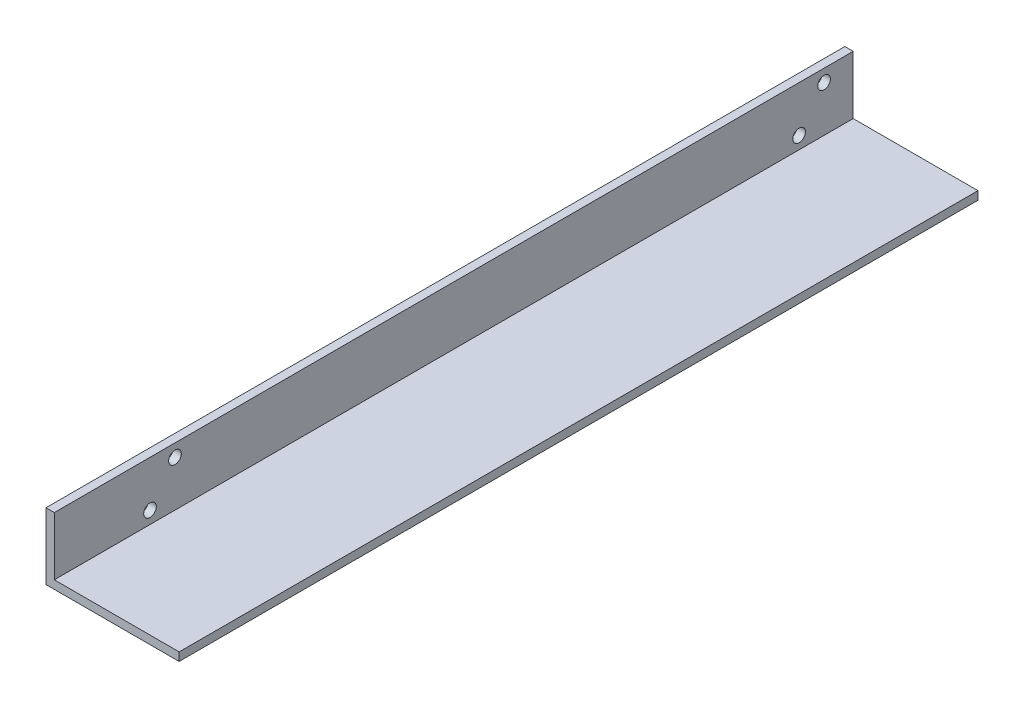
ISO-10303-21;
HEADER;
FILE_DESCRIPTION(('STEP AP214'),'2;1');
FILE_NAME('part.step','',(''),(''),'','','');
FILE_SCHEMA(('AUTOMOTIVE_DESIGN { 1 0 10303 214 1 1 1 1 }'));
ENDSEC;
DATA;
#1=APPLICATION_CONTEXT('core data for automotive mechanical design processes');
#2=APPLICATION_PROTOCOL_DEFINITION('international standard','automotive_design',2000,#1);
#3=PRODUCT_CONTEXT('',#1,'mechanical');
#4=PRODUCT('Part','Part','',(#3));
#5=PRODUCT_RELATED_PRODUCT_CATEGORY('part','',(#4));
#6=PRODUCT_DEFINITION_FORMATION('','',#4);
#7=PRODUCT_DEFINITION_CONTEXT('part definition',#1,'design');
#8=PRODUCT_DEFINITION('design','',#6,#7);
#9=PRODUCT_DEFINITION_SHAPE('','',#8);
#10=(LENGTH_UNIT() NAMED_UNIT(*) SI_UNIT(.MILLI.,.METRE.));
#11=(NAMED_UNIT(*) PLANE_ANGLE_UNIT() SI_UNIT($,.RADIAN.));
#12=(NAMED_UNIT(*) SI_UNIT($,.STERADIAN.) SOLID_ANGLE_UNIT());
#13=UNCERTAINTY_MEASURE_WITH_UNIT(LENGTH_MEASURE(1.E-05),#10,'distance_accuracy_value','');
#14=(GEOMETRIC_REPRESENTATION_CONTEXT(3) GLOBAL_UNCERTAINTY_ASSIGNED_CONTEXT((#13)) GLOBAL_UNIT_ASSIGNED_CONTEXT((#10,
#11,#12)) REPRESENTATION_CONTEXT('',''));
#15=CARTESIAN_POINT('',(0.,0.,0.));
#16=DIRECTION('',(0.,0.,1.));
#17=DIRECTION('',(1.,0.,0.));
#18=AXIS2_PLACEMENT_3D('',#15,#16,#17);
#19=CARTESIAN_POINT('',(0.,0.,304.8));
#20=DIRECTION('',(1.,0.,0.));
#21=DIRECTION('',(0.,0.,-1.));
#22=AXIS2_PLACEMENT_3D('',#19,#20,#21);
#23=PLANE('',#22);
#24=CARTESIAN_POINT('',(0.,7.93749999999971,268.2875));
#25=DIRECTION('',(-1.,0.,0.));
#26=DIRECTION('',(0.,0.,1.));
#27=AXIS2_PLACEMENT_3D('',#24,#25,#26);
#28=CIRCLE('',#27,2.41299999999999);
#29=CARTESIAN_POINT('',(0.,7.93749999999971,270.7005));
#30=VERTEX_POINT('',#29);
#31=EDGE_CURVE('E208',#30,#30,#28,.T.);
#32=ORIENTED_EDGE('',*,*,#31,.F.);
#33=EDGE_LOOP('',(#32));
#34=FACE_BOUND('',#33,.T.);
#35=CARTESIAN_POINT('',(0.,20.6374999999996,11.1125));
#36=DIRECTION('',(-1.,0.,0.));
#37=DIRECTION('',(0.,0.,1.));
#38=AXIS2_PLACEMENT_3D('',#35,#36,#37);
#39=CIRCLE('',#38,2.413);
#40=CARTESIAN_POINT('',(0.,20.6374999999996,13.5255));
#41=VERTEX_POINT('',#40);
#42=EDGE_CURVE('E212',#41,#41,#39,.T.);
#43=ORIENTED_EDGE('',*,*,#42,.F.);
#44=EDGE_LOOP('',(#43));
#45=FACE_BOUND('',#44,.T.);
#46=CARTESIAN_POINT('',(0.,7.93749999999971,20.6375000000001));
#47=DIRECTION('',(-1.,0.,0.));
#48=DIRECTION('',(0.,0.,1.));
#49=AXIS2_PLACEMENT_3D('',#46,#47,#48);
#50=CIRCLE('',#49,2.413);
#51=CARTESIAN_POINT('',(0.,7.93749999999971,23.0505000000001));
#52=VERTEX_POINT('',#51);
#53=EDGE_CURVE('E216',#52,#52,#50,.T.);
#54=ORIENTED_EDGE('',*,*,#53,.F.);
#55=EDGE_LOOP('',(#54));
#56=FACE_BOUND('',#55,.T.);
#57=CARTESIAN_POINT('',(0.,20.6374999999996,258.7625));
#58=DIRECTION('',(-1.,0.,0.));
#59=DIRECTION('',(0.,0.,1.));
#60=AXIS2_PLACEMENT_3D('',#57,#58,#59);
#61=CIRCLE('',#60,2.413);
#62=CARTESIAN_POINT('',(0.,20.6374999999996,261.1755));
#63=VERTEX_POINT('',#62);
#64=EDGE_CURVE('E219',#63,#63,#61,.T.);
#65=ORIENTED_EDGE('',*,*,#64,.F.);
#66=EDGE_LOOP('',(#65));
#67=FACE_BOUND('',#66,.T.);
#68=DIRECTION('',(0.,-1.,0.));
#69=VECTOR('',#68,1.);
#70=CARTESIAN_POINT('',(0.,0.,0.));
#71=LINE('',#70,#69);
#72=CARTESIAN_POINT('',(0.,25.4,0.));
#73=VERTEX_POINT('',#72);
#74=CARTESIAN_POINT('',(0.,0.,0.));
#75=VERTEX_POINT('',#74);
#76=EDGE_CURVE('E152',#73,#75,#71,.T.);
#77=ORIENTED_EDGE('',*,*,#76,.T.);
#78=DIRECTION('',(0.,0.,-1.));
#79=VECTOR('',#78,1.);
#80=CARTESIAN_POINT('',(0.,0.,304.8));
#81=LINE('',#80,#79);
#82=CARTESIAN_POINT('',(0.,0.,304.8));
#83=VERTEX_POINT('',#82);
#84=EDGE_CURVE('E13',#83,#75,#81,.T.);
#85=ORIENTED_EDGE('',*,*,#84,.F.);
#86=DIRECTION('',(0.,-1.,0.));
#87=VECTOR('',#86,1.);
#88=CARTESIAN_POINT('',(0.,0.,304.8));
#89=LINE('',#88,#87);
#90=CARTESIAN_POINT('',(0.,25.4,304.8));
#91=VERTEX_POINT('',#90);
#92=EDGE_CURVE('E169',#91,#83,#89,.T.);
#93=ORIENTED_EDGE('',*,*,#92,.F.);
#94=DIRECTION('',(0.,0.,-1.));
#95=VECTOR('',#94,1.);
#96=CARTESIAN_POINT('',(0.,25.4,304.8));
#97=LINE('',#96,#95);
#98=EDGE_CURVE('E148',#91,#73,#97,.T.);
#99=ORIENTED_EDGE('',*,*,#98,.T.);
#100=EDGE_LOOP('',(#77,#85,#93,#99));
#101=FACE_BOUND('',#100,.T.);
#102=ADVANCED_FACE('F50',(#34,#45,#56,#67,#101),#23,.F.);
#103=CARTESIAN_POINT('',(0.,0.,304.8));
#104=DIRECTION('',(0.,1.,0.));
#105=DIRECTION('',(0.,0.,1.));
#106=AXIS2_PLACEMENT_3D('',#103,#104,#105);
#107=PLANE('',#106);
#108=DIRECTION('',(1.,0.,0.));
#109=VECTOR('',#108,1.);
#110=CARTESIAN_POINT('',(0.,0.,0.));
#111=LINE('',#110,#109);
#112=CARTESIAN_POINT('',(50.8,0.,0.));
#113=VERTEX_POINT('',#112);
#114=EDGE_CURVE('E156',#75,#113,#111,.T.);
#115=ORIENTED_EDGE('',*,*,#114,.T.);
#116=DIRECTION('',(0.,0.,-1.));
#117=VECTOR('',#116,1.);
#118=CARTESIAN_POINT('',(50.8,0.,304.8));
#119=LINE('',#118,#117);
#120=CARTESIAN_POINT('',(50.8,0.,304.8));
#121=VERTEX_POINT('',#120);
#122=EDGE_CURVE('E59',#121,#113,#119,.T.);
#123=ORIENTED_EDGE('',*,*,#122,.F.);
#124=DIRECTION('',(1.,0.,0.));
#125=VECTOR('',#124,1.);
#126=CARTESIAN_POINT('',(0.,0.,304.8));
#127=LINE('',#126,#125);
#128=EDGE_CURVE('E116',#83,#121,#127,.T.);
#129=ORIENTED_EDGE('',*,*,#128,.F.);
#130=ORIENTED_EDGE('',*,*,#84,.T.);
#131=EDGE_LOOP('',(#115,#123,#129,#130));
#132=FACE_BOUND('',#131,.T.);
#133=ADVANCED_FACE('F200',(#132),#107,.F.);
#134=CARTESIAN_POINT('',(50.8,0.,304.8));
#135=DIRECTION('',(-1.,0.,0.));
#136=DIRECTION('',(0.,0.,1.));
#137=AXIS2_PLACEMENT_3D('',#134,#135,#136);
#138=PLANE('',#137);
#139=DIRECTION('',(0.,1.,0.));
#140=VECTOR('',#139,1.);
#141=CARTESIAN_POINT('',(50.8,0.,0.));
#142=LINE('',#141,#140);
#143=CARTESIAN_POINT('',(50.8,3.175,0.));
#144=VERTEX_POINT('',#143);
#145=EDGE_CURVE('E160',#113,#144,#142,.T.);
#146=ORIENTED_EDGE('',*,*,#145,.T.);
#147=DIRECTION('',(0.,0.,-1.));
#148=VECTOR('',#147,1.);
#149=CARTESIAN_POINT('',(50.8,3.175,304.8));
#150=LINE('',#149,#148);
#151=CARTESIAN_POINT('',(50.8,3.175,304.8));
#152=VERTEX_POINT('',#151);
#153=EDGE_CURVE('E140',#152,#144,#150,.T.);
#154=ORIENTED_EDGE('',*,*,#153,.F.);
#155=DIRECTION('',(0.,1.,0.));
#156=VECTOR('',#155,1.);
#157=CARTESIAN_POINT('',(50.8,0.,304.8));
#158=LINE('',#157,#156);
#159=EDGE_CURVE('E129',#121,#152,#158,.T.);
#160=ORIENTED_EDGE('',*,*,#159,.F.);
#161=ORIENTED_EDGE('',*,*,#122,.T.);
#162=EDGE_LOOP('',(#146,#154,#160,#161));
#163=FACE_BOUND('',#162,.T.);
#164=ADVANCED_FACE('F181',(#163),#138,.F.);
#165=CARTESIAN_POINT('',(3.175,3.175,304.8));
#166=DIRECTION('',(0.,-1.,0.));
#167=DIRECTION('',(0.,0.,-1.));
#168=AXIS2_PLACEMENT_3D('',#165,#166,#167);
#169=PLANE('',#168);
#170=DIRECTION('',(-1.,0.,0.));
#171=VECTOR('',#170,1.);
#172=CARTESIAN_POINT('',(3.175,3.175,0.));
#173=LINE('',#172,#171);
#174=CARTESIAN_POINT('',(3.175,3.175,0.));
#175=VERTEX_POINT('',#174);
#176=EDGE_CURVE('E138',#144,#175,#173,.T.);
#177=ORIENTED_EDGE('',*,*,#176,.T.);
#178=DIRECTION('',(0.,0.,-1.));
#179=VECTOR('',#178,1.);
#180=CARTESIAN_POINT('',(3.175,3.175,304.8));
#181=LINE('',#180,#179);
#182=CARTESIAN_POINT('',(3.175,3.175,304.8));
#183=VERTEX_POINT('',#182);
#184=EDGE_CURVE('E135',#183,#175,#181,.T.);
#185=ORIENTED_EDGE('',*,*,#184,.F.);
#186=DIRECTION('',(-1.,0.,0.));
#187=VECTOR('',#186,1.);
#188=CARTESIAN_POINT('',(3.175,3.175,304.8));
#189=LINE('',#188,#187);
#190=EDGE_CURVE('E123',#152,#183,#189,.T.);
#191=ORIENTED_EDGE('',*,*,#190,.F.);
#192=ORIENTED_EDGE('',*,*,#153,.T.);
#193=EDGE_LOOP('',(#177,#185,#191,#192));
#194=FACE_BOUND('',#193,.T.);
#195=ADVANCED_FACE('F136',(#194),#169,.F.);
#196=CARTESIAN_POINT('',(3.175,3.175,304.8));
#197=DIRECTION('',(-1.,0.,0.));
#198=DIRECTION('',(0.,0.,1.));
#199=AXIS2_PLACEMENT_3D('',#196,#197,#198);
#200=PLANE('',#199);
#201=CARTESIAN_POINT('',(3.175,7.93749999999971,268.2875));
#202=DIRECTION('',(-1.,0.,0.));
#203=DIRECTION('',(0.,0.,1.));
#204=AXIS2_PLACEMENT_3D('',#201,#202,#203);
#205=CIRCLE('',#204,2.41299999999999);
#206=CARTESIAN_POINT('',(3.175,7.93749999999971,270.7005));
#207=VERTEX_POINT('',#206);
#208=EDGE_CURVE('E222',#207,#207,#205,.F.);
#209=ORIENTED_EDGE('',*,*,#208,.F.);
#210=EDGE_LOOP('',(#209));
#211=FACE_BOUND('',#210,.T.);
#212=CARTESIAN_POINT('',(3.175,20.6374999999996,11.1125));
#213=DIRECTION('',(-1.,0.,0.));
#214=DIRECTION('',(0.,0.,1.));
#215=AXIS2_PLACEMENT_3D('',#212,#213,#214);
#216=CIRCLE('',#215,2.413);
#217=CARTESIAN_POINT('',(3.175,20.6374999999996,13.5255));
#218=VERTEX_POINT('',#217);
#219=EDGE_CURVE('E231',#218,#218,#216,.F.);
#220=ORIENTED_EDGE('',*,*,#219,.F.);
#221=EDGE_LOOP('',(#220));
#222=FACE_BOUND('',#221,.T.);
#223=CARTESIAN_POINT('',(3.175,7.93749999999971,20.6375000000001));
#224=DIRECTION('',(-1.,0.,0.));
#225=DIRECTION('',(0.,0.,1.));
#226=AXIS2_PLACEMENT_3D('',#223,#224,#225);
#227=CIRCLE('',#226,2.413);
#228=CARTESIAN_POINT('',(3.175,7.93749999999971,23.0505000000001));
#229=VERTEX_POINT('',#228);
#230=EDGE_CURVE('E236',#229,#229,#227,.F.);
#231=ORIENTED_EDGE('',*,*,#230,.F.);
#232=EDGE_LOOP('',(#231));
#233=FACE_BOUND('',#232,.T.);
#234=CARTESIAN_POINT('',(3.175,20.6374999999996,258.7625));
#235=DIRECTION('',(-1.,0.,0.));
#236=DIRECTION('',(0.,0.,1.));
#237=AXIS2_PLACEMENT_3D('',#234,#235,#236);
#238=CIRCLE('',#237,2.413);
#239=CARTESIAN_POINT('',(3.175,20.6374999999996,261.1755));
#240=VERTEX_POINT('',#239);
#241=EDGE_CURVE('E157',#240,#240,#238,.F.);
#242=ORIENTED_EDGE('',*,*,#241,.F.);
#243=EDGE_LOOP('',(#242));
#244=FACE_BOUND('',#243,.T.);
#245=DIRECTION('',(0.,1.,0.));
#246=VECTOR('',#245,1.);
#247=CARTESIAN_POINT('',(3.175,3.175,0.));
#248=LINE('',#247,#246);
#249=CARTESIAN_POINT('',(3.175,25.4,0.));
#250=VERTEX_POINT('',#249);
#251=EDGE_CURVE('E98',#175,#250,#248,.T.);
#252=ORIENTED_EDGE('',*,*,#251,.T.);
#253=DIRECTION('',(0.,0.,-1.));
#254=VECTOR('',#253,1.);
#255=CARTESIAN_POINT('',(3.175,25.4,304.8));
#256=LINE('',#255,#254);
#257=CARTESIAN_POINT('',(3.175,25.4,304.8));
#258=VERTEX_POINT('',#257);
#259=EDGE_CURVE('E141',#258,#250,#256,.T.);
#260=ORIENTED_EDGE('',*,*,#259,.F.);
#261=DIRECTION('',(0.,1.,0.));
#262=VECTOR('',#261,1.);
#263=CARTESIAN_POINT('',(3.175,3.175,304.8));
#264=LINE('',#263,#262);
#265=EDGE_CURVE('E127',#183,#258,#264,.T.);
#266=ORIENTED_EDGE('',*,*,#265,.F.);
#267=ORIENTED_EDGE('',*,*,#184,.T.);
#268=EDGE_LOOP('',(#252,#260,#266,#267));
#269=FACE_BOUND('',#268,.T.);
#270=ADVANCED_FACE('F143',(#211,#222,#233,#244,#269),#200,.F.);
#271=CARTESIAN_POINT('',(0.,25.4,304.8));
#272=DIRECTION('',(0.,-1.,0.));
#273=DIRECTION('',(0.,0.,-1.));
#274=AXIS2_PLACEMENT_3D('',#271,#272,#273);
#275=PLANE('',#274);
#276=DIRECTION('',(-1.,0.,0.));
#277=VECTOR('',#276,1.);
#278=CARTESIAN_POINT('',(0.,25.4,0.));
#279=LINE('',#278,#277);
#280=EDGE_CURVE('E105',#250,#73,#279,.T.);
#281=ORIENTED_EDGE('',*,*,#280,.T.);
#282=ORIENTED_EDGE('',*,*,#98,.F.);
#283=DIRECTION('',(-1.,0.,0.));
#284=VECTOR('',#283,1.);
#285=CARTESIAN_POINT('',(0.,25.4,304.8));
#286=LINE('',#285,#284);
#287=EDGE_CURVE('E69',#258,#91,#286,.T.);
#288=ORIENTED_EDGE('',*,*,#287,.F.);
#289=ORIENTED_EDGE('',*,*,#259,.T.);
#290=EDGE_LOOP('',(#281,#282,#288,#289));
#291=FACE_BOUND('',#290,.T.);
#292=ADVANCED_FACE('F188',(#291),#275,.F.);
#293=CARTESIAN_POINT('',(0.,0.,304.8));
#294=DIRECTION('',(0.,0.,-1.));
#295=DIRECTION('',(-1.,0.,0.));
#296=AXIS2_PLACEMENT_3D('',#293,#294,#295);
#297=PLANE('',#296);
#298=ORIENTED_EDGE('',*,*,#92,.T.);
#299=ORIENTED_EDGE('',*,*,#128,.T.);
#300=ORIENTED_EDGE('',*,*,#159,.T.);
#301=ORIENTED_EDGE('',*,*,#190,.T.);
#302=ORIENTED_EDGE('',*,*,#265,.T.);
#303=ORIENTED_EDGE('',*,*,#287,.T.);
#304=EDGE_LOOP('',(#298,#299,#300,#301,#302,#303));
#305=FACE_BOUND('',#304,.T.);
#306=ADVANCED_FACE('F125',(#305),#297,.F.);
#307=CARTESIAN_POINT('',(0.,0.,0.));
#308=DIRECTION('',(0.,0.,-1.));
#309=DIRECTION('',(-1.,0.,0.));
#310=AXIS2_PLACEMENT_3D('',#307,#308,#309);
#311=PLANE('',#310);
#312=ORIENTED_EDGE('',*,*,#76,.F.);
#313=ORIENTED_EDGE('',*,*,#280,.F.);
#314=ORIENTED_EDGE('',*,*,#251,.F.);
#315=ORIENTED_EDGE('',*,*,#176,.F.);
#316=ORIENTED_EDGE('',*,*,#145,.F.);
#317=ORIENTED_EDGE('',*,*,#114,.F.);
#318=EDGE_LOOP('',(#312,#313,#314,#315,#316,#317));
#319=FACE_BOUND('',#318,.T.);
#320=ADVANCED_FACE('F184',(#319),#311,.T.);
#321=CARTESIAN_POINT('',(50.801,20.6374999999996,258.7625));
#322=DIRECTION('',(-1.,0.,0.));
#323=DIRECTION('',(0.,0.,1.));
#324=AXIS2_PLACEMENT_3D('',#321,#322,#323);
#325=CYLINDRICAL_SURFACE('',#324,2.413);
#326=ORIENTED_EDGE('',*,*,#64,.T.);
#327=EDGE_LOOP('',(#326));
#328=FACE_BOUND('',#327,.T.);
#329=ORIENTED_EDGE('',*,*,#241,.T.);
#330=EDGE_LOOP('',(#329));
#331=FACE_BOUND('',#330,.T.);
#332=ADVANCED_FACE('F261',(#328,#331),#325,.F.);
#333=CARTESIAN_POINT('',(50.801,7.93749999999971,20.6375000000001));
#334=DIRECTION('',(-1.,0.,0.));
#335=DIRECTION('',(0.,0.,1.));
#336=AXIS2_PLACEMENT_3D('',#333,#334,#335);
#337=CYLINDRICAL_SURFACE('',#336,2.413);
#338=ORIENTED_EDGE('',*,*,#53,.T.);
#339=EDGE_LOOP('',(#338));
#340=FACE_BOUND('',#339,.T.);
#341=ORIENTED_EDGE('',*,*,#230,.T.);
#342=EDGE_LOOP('',(#341));
#343=FACE_BOUND('',#342,.T.);
#344=ADVANCED_FACE('F263',(#340,#343),#337,.F.);
#345=CARTESIAN_POINT('',(50.801,20.6374999999996,11.1125));
#346=DIRECTION('',(-1.,0.,0.));
#347=DIRECTION('',(0.,0.,1.));
#348=AXIS2_PLACEMENT_3D('',#345,#346,#347);
#349=CYLINDRICAL_SURFACE('',#348,2.413);
#350=ORIENTED_EDGE('',*,*,#42,.T.);
#351=EDGE_LOOP('',(#350));
#352=FACE_BOUND('',#351,.T.);
#353=ORIENTED_EDGE('',*,*,#219,.T.);
#354=EDGE_LOOP('',(#353));
#355=FACE_BOUND('',#354,.T.);
#356=ADVANCED_FACE('F252',(#352,#355),#349,.F.);
#357=CARTESIAN_POINT('',(50.801,7.93749999999971,268.2875));
#358=DIRECTION('',(-1.,0.,0.));
#359=DIRECTION('',(0.,0.,1.));
#360=AXIS2_PLACEMENT_3D('',#357,#358,#359);
#361=CYLINDRICAL_SURFACE('',#360,2.41299999999999);
#362=ORIENTED_EDGE('',*,*,#31,.T.);
#363=EDGE_LOOP('',(#362));
#364=FACE_BOUND('',#363,.T.);
#365=ORIENTED_EDGE('',*,*,#208,.T.);
#366=EDGE_LOOP('',(#365));
#367=FACE_BOUND('',#366,.T.);
#368=ADVANCED_FACE('F249',(#364,#367),#361,.F.);
#369=CLOSED_SHELL('',(#102,#133,#164,#195,#270,#292,#306,#320,#332,#344,#356,#368));
#370=MANIFOLD_SOLID_BREP('B2',#369);
#371=ADVANCED_BREP_SHAPE_REPRESENTATION('',(#18,#370),#14);
#372=SHAPE_DEFINITION_REPRESENTATION(#9,#371);
ENDSEC;
END-ISO-10303-21;
